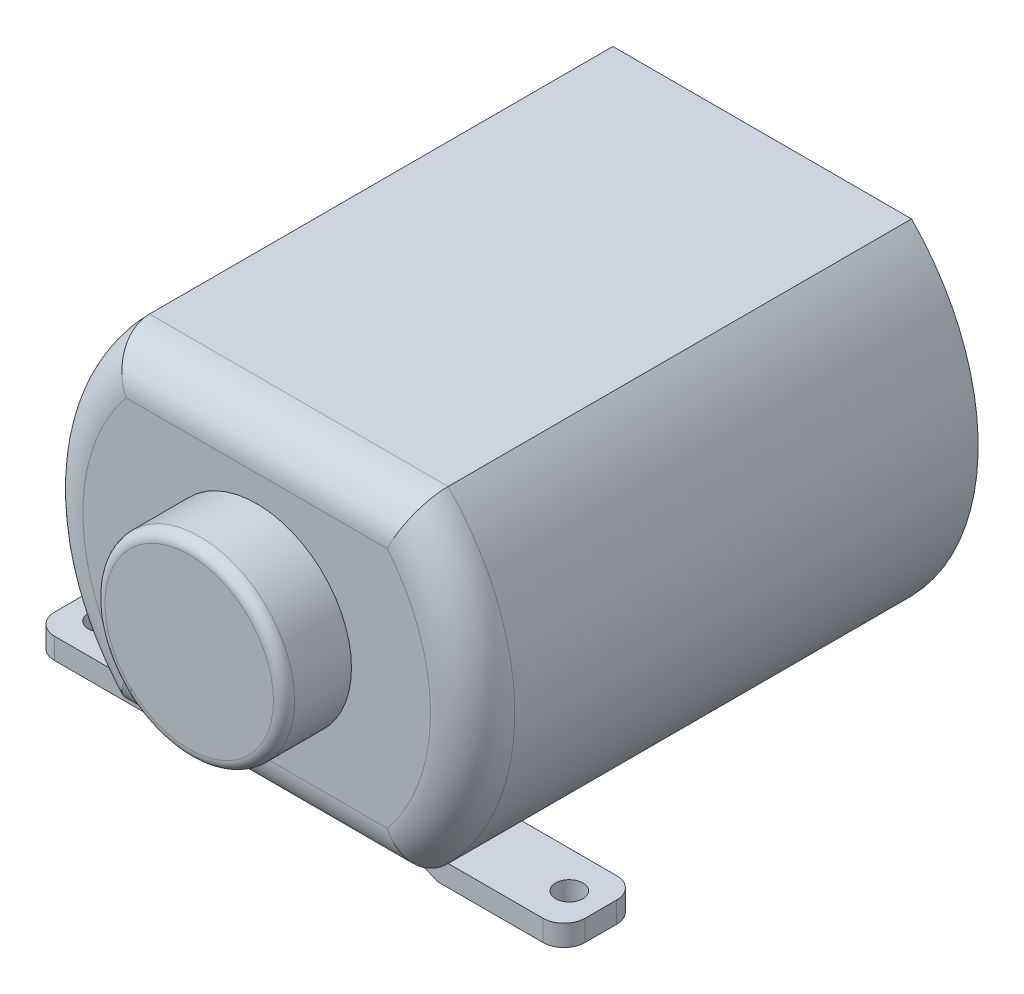
ISO-10303-21;
HEADER;
FILE_DESCRIPTION(('STEP AP214'),'2;1');
FILE_NAME('part.step','',(''),(''),'','','');
FILE_SCHEMA(('AUTOMOTIVE_DESIGN { 1 0 10303 214 1 1 1 1 }'));
ENDSEC;
DATA;
#1=APPLICATION_CONTEXT('core data for automotive mechanical design processes');
#2=APPLICATION_PROTOCOL_DEFINITION('international standard','automotive_design',2000,#1);
#3=PRODUCT_CONTEXT('',#1,'mechanical');
#4=PRODUCT('Part','Part','',(#3));
#5=PRODUCT_RELATED_PRODUCT_CATEGORY('part','',(#4));
#6=PRODUCT_DEFINITION_FORMATION('','',#4);
#7=PRODUCT_DEFINITION_CONTEXT('part definition',#1,'design');
#8=PRODUCT_DEFINITION('design','',#6,#7);
#9=PRODUCT_DEFINITION_SHAPE('','',#8);
#10=(LENGTH_UNIT() NAMED_UNIT(*) SI_UNIT(.MILLI.,.METRE.));
#11=(NAMED_UNIT(*) PLANE_ANGLE_UNIT() SI_UNIT($,.RADIAN.));
#12=(NAMED_UNIT(*) SI_UNIT($,.STERADIAN.) SOLID_ANGLE_UNIT());
#13=UNCERTAINTY_MEASURE_WITH_UNIT(LENGTH_MEASURE(1.E-05),#10,'distance_accuracy_value','');
#14=(GEOMETRIC_REPRESENTATION_CONTEXT(3) GLOBAL_UNCERTAINTY_ASSIGNED_CONTEXT((#13)) GLOBAL_UNIT_ASSIGNED_CONTEXT((#10,
#11,#12)) REPRESENTATION_CONTEXT('',''));
#15=CARTESIAN_POINT('',(0.,0.,0.));
#16=DIRECTION('',(0.,0.,1.));
#17=DIRECTION('',(1.,0.,0.));
#18=AXIS2_PLACEMENT_3D('',#15,#16,#17);
#19=CARTESIAN_POINT('',(7.09,-7.75,24.));
#20=DIRECTION('',(0.,1.,0.));
#21=DIRECTION('',(0.,0.,1.));
#22=AXIS2_PLACEMENT_3D('',#19,#20,#21);
#23=PLANE('',#22);
#24=DIRECTION('',(-1.,0.,0.));
#25=VECTOR('',#24,1.);
#26=CARTESIAN_POINT('',(6.59,-7.75,18.5));
#27=LINE('',#26,#25);
#28=CARTESIAN_POINT('',(7.09,-7.75,18.5));
#29=VERTEX_POINT('',#28);
#30=CARTESIAN_POINT('',(2.23110105645932,-7.75,18.5));
#31=VERTEX_POINT('',#30);
#32=EDGE_CURVE('E58',#29,#31,#27,.T.);
#33=ORIENTED_EDGE('',*,*,#32,.T.);
#34=DIRECTION('',(0.,0.,-1.));
#35=VECTOR('',#34,1.);
#36=CARTESIAN_POINT('',(2.23110105645932,-7.75,24.));
#37=LINE('',#36,#35);
#38=CARTESIAN_POINT('',(2.23110105645932,-7.75,22.));
#39=VERTEX_POINT('',#38);
#40=EDGE_CURVE('E192',#31,#39,#37,.F.);
#41=ORIENTED_EDGE('',*,*,#40,.T.);
#42=DIRECTION('',(1.,0.,0.));
#43=VECTOR('',#42,1.);
#44=CARTESIAN_POINT('',(-7.09,-7.75,22.));
#45=LINE('',#44,#43);
#46=CARTESIAN_POINT('',(-2.23110105645932,-7.75,22.));
#47=VERTEX_POINT('',#46);
#48=EDGE_CURVE('E477',#39,#47,#45,.F.);
#49=ORIENTED_EDGE('',*,*,#48,.T.);
#50=DIRECTION('',(0.,0.,-1.));
#51=VECTOR('',#50,1.);
#52=CARTESIAN_POINT('',(-2.23110105645932,-7.75,24.));
#53=LINE('',#52,#51);
#54=CARTESIAN_POINT('',(-2.23110105645932,-7.75,18.5));
#55=VERTEX_POINT('',#54);
#56=EDGE_CURVE('E201',#47,#55,#53,.T.);
#57=ORIENTED_EDGE('',*,*,#56,.T.);
#58=DIRECTION('',(1.,0.,0.));
#59=VECTOR('',#58,1.);
#60=CARTESIAN_POINT('',(-6.59,-7.75,18.5));
#61=LINE('',#60,#59);
#62=CARTESIAN_POINT('',(-7.09,-7.75,18.5));
#63=VERTEX_POINT('',#62);
#64=EDGE_CURVE('E423',#63,#55,#61,.T.);
#65=ORIENTED_EDGE('',*,*,#64,.F.);
#66=DIRECTION('',(0.,0.,-1.));
#67=VECTOR('',#66,1.);
#68=CARTESIAN_POINT('',(-7.09,-7.75,24.));
#69=LINE('',#68,#67);
#70=CARTESIAN_POINT('',(-7.09,-7.75,0.));
#71=VERTEX_POINT('',#70);
#72=EDGE_CURVE('E459',#63,#71,#69,.T.);
#73=ORIENTED_EDGE('',*,*,#72,.T.);
#74=DIRECTION('',(1.,0.,0.));
#75=VECTOR('',#74,1.);
#76=CARTESIAN_POINT('',(7.09,-7.75,0.));
#77=LINE('',#76,#75);
#78=CARTESIAN_POINT('',(7.09,-7.75,0.));
#79=VERTEX_POINT('',#78);
#80=EDGE_CURVE('E442',#71,#79,#77,.T.);
#81=ORIENTED_EDGE('',*,*,#80,.T.);
#82=DIRECTION('',(0.,0.,-1.));
#83=VECTOR('',#82,1.);
#84=CARTESIAN_POINT('',(7.09,-7.75,24.));
#85=LINE('',#84,#83);
#86=EDGE_CURVE('E455',#29,#79,#85,.T.);
#87=ORIENTED_EDGE('',*,*,#86,.F.);
#88=EDGE_LOOP('',(#33,#41,#49,#57,#65,#73,#81,#87));
#89=FACE_BOUND('',#88,.T.);
#90=ADVANCED_FACE('F43',(#89),#23,.F.);
#91=CARTESIAN_POINT('',(0.833560126582283,0.,24.));
#92=DIRECTION('',(0.,0.,-1.));
#93=DIRECTION('',(-1.,0.,0.));
#94=AXIS2_PLACEMENT_3D('',#91,#92,#93);
#95=CYLINDRICAL_SURFACE('',#94,11.0835601265823);
#96=CARTESIAN_POINT('',(-7.09,-7.75,22.));
#97=VERTEX_POINT('',#96);
#98=EDGE_CURVE('E460',#97,#63,#69,.T.);
#99=ORIENTED_EDGE('',*,*,#98,.F.);
#100=CARTESIAN_POINT('',(0.833560126582283,0.,22.));
#101=DIRECTION('',(0.,0.,1.));
#102=DIRECTION('',(1.,0.,0.));
#103=AXIS2_PLACEMENT_3D('',#100,#101,#102);
#104=CIRCLE('',#103,11.0835601265823);
#105=CARTESIAN_POINT('',(-7.09,7.75,22.));
#106=VERTEX_POINT('',#105);
#107=EDGE_CURVE('E210',#97,#106,#104,.F.);
#108=ORIENTED_EDGE('',*,*,#107,.T.);
#109=DIRECTION('',(0.,0.,-1.));
#110=VECTOR('',#109,1.);
#111=CARTESIAN_POINT('',(-7.09,7.75,24.));
#112=LINE('',#111,#110);
#113=CARTESIAN_POINT('',(-7.09,7.75,0.));
#114=VERTEX_POINT('',#113);
#115=EDGE_CURVE('E451',#106,#114,#112,.T.);
#116=ORIENTED_EDGE('',*,*,#115,.T.);
#117=CARTESIAN_POINT('',(0.833560126582283,0.,0.));
#118=DIRECTION('',(0.,0.,1.));
#119=DIRECTION('',(1.,0.,0.));
#120=AXIS2_PLACEMENT_3D('',#117,#118,#119);
#121=CIRCLE('',#120,11.0835601265823);
#122=EDGE_CURVE('E220',#114,#71,#121,.T.);
#123=ORIENTED_EDGE('',*,*,#122,.T.);
#124=ORIENTED_EDGE('',*,*,#72,.F.);
#125=EDGE_LOOP('',(#99,#108,#116,#123,#124));
#126=FACE_BOUND('',#125,.T.);
#127=ADVANCED_FACE('F257',(#126),#95,.T.);
#128=CARTESIAN_POINT('',(-0.833560126582283,0.,24.));
#129=DIRECTION('',(0.,0.,-1.));
#130=DIRECTION('',(-1.,0.,0.));
#131=AXIS2_PLACEMENT_3D('',#128,#129,#130);
#132=CYLINDRICAL_SURFACE('',#131,11.0835601265823);
#133=DIRECTION('',(0.,0.,-1.));
#134=VECTOR('',#133,1.);
#135=CARTESIAN_POINT('',(7.09,7.75,24.));
#136=LINE('',#135,#134);
#137=CARTESIAN_POINT('',(7.09,7.75,22.));
#138=VERTEX_POINT('',#137);
#139=CARTESIAN_POINT('',(7.09,7.75,0.));
#140=VERTEX_POINT('',#139);
#141=EDGE_CURVE('E453',#138,#140,#136,.T.);
#142=ORIENTED_EDGE('',*,*,#141,.F.);
#143=CARTESIAN_POINT('',(-0.833560126582283,0.,22.));
#144=DIRECTION('',(0.,0.,1.));
#145=DIRECTION('',(1.,0.,0.));
#146=AXIS2_PLACEMENT_3D('',#143,#144,#145);
#147=CIRCLE('',#146,11.0835601265823);
#148=CARTESIAN_POINT('',(7.09,-7.75,22.));
#149=VERTEX_POINT('',#148);
#150=EDGE_CURVE('E475',#138,#149,#147,.F.);
#151=ORIENTED_EDGE('',*,*,#150,.T.);
#152=EDGE_CURVE('E456',#149,#29,#85,.T.);
#153=ORIENTED_EDGE('',*,*,#152,.T.);
#154=ORIENTED_EDGE('',*,*,#86,.T.);
#155=CARTESIAN_POINT('',(-0.833560126582283,0.,0.));
#156=DIRECTION('',(0.,0.,1.));
#157=DIRECTION('',(-1.,0.,0.));
#158=AXIS2_PLACEMENT_3D('',#155,#156,#157);
#159=CIRCLE('',#158,11.0835601265823);
#160=EDGE_CURVE('E445',#79,#140,#159,.T.);
#161=ORIENTED_EDGE('',*,*,#160,.T.);
#162=EDGE_LOOP('',(#142,#151,#153,#154,#161));
#163=FACE_BOUND('',#162,.T.);
#164=ADVANCED_FACE('F261',(#163),#132,.T.);
#165=CARTESIAN_POINT('',(7.09,7.75,24.));
#166=DIRECTION('',(0.,-1.,0.));
#167=DIRECTION('',(0.,0.,-1.));
#168=AXIS2_PLACEMENT_3D('',#165,#166,#167);
#169=PLANE('',#168);
#170=ORIENTED_EDGE('',*,*,#115,.F.);
#171=DIRECTION('',(-1.,0.,0.));
#172=VECTOR('',#171,1.);
#173=CARTESIAN_POINT('',(7.09,7.75,22.));
#174=LINE('',#173,#172);
#175=EDGE_CURVE('E472',#106,#138,#174,.F.);
#176=ORIENTED_EDGE('',*,*,#175,.T.);
#177=ORIENTED_EDGE('',*,*,#141,.T.);
#178=DIRECTION('',(-1.,0.,0.));
#179=VECTOR('',#178,1.);
#180=CARTESIAN_POINT('',(7.09,7.75,0.));
#181=LINE('',#180,#179);
#182=EDGE_CURVE('E448',#140,#114,#181,.T.);
#183=ORIENTED_EDGE('',*,*,#182,.T.);
#184=EDGE_LOOP('',(#170,#176,#177,#183));
#185=FACE_BOUND('',#184,.T.);
#186=ADVANCED_FACE('F267',(#185),#169,.F.);
#187=CARTESIAN_POINT('',(0.833560126582283,0.,24.));
#188=DIRECTION('',(0.,0.,1.));
#189=DIRECTION('',(1.,0.,0.));
#190=AXIS2_PLACEMENT_3D('',#187,#188,#189);
#191=PLANE('',#190);
#192=CARTESIAN_POINT('',(0.,0.,24.));
#193=DIRECTION('',(0.,0.,1.));
#194=DIRECTION('',(1.,0.,0.));
#195=AXIS2_PLACEMENT_3D('',#192,#193,#194);
#196=CIRCLE('',#195,4.5);
#197=CARTESIAN_POINT('',(4.5,0.,24.));
#198=VERTEX_POINT('',#197);
#199=EDGE_CURVE('E437',#198,#198,#196,.T.);
#200=ORIENTED_EDGE('',*,*,#199,.F.);
#201=EDGE_LOOP('',(#200));
#202=FACE_BOUND('',#201,.T.);
#203=CARTESIAN_POINT('',(-0.833560126582283,0.,24.));
#204=DIRECTION('',(0.,0.,1.));
#205=DIRECTION('',(1.,0.,0.));
#206=AXIS2_PLACEMENT_3D('',#203,#204,#205);
#207=CIRCLE('',#206,9.08356012658228);
#208=CARTESIAN_POINT('',(6.19840720647861,-5.75,24.));
#209=VERTEX_POINT('',#208);
#210=CARTESIAN_POINT('',(6.19840720647861,5.75,24.));
#211=VERTEX_POINT('',#210);
#212=EDGE_CURVE('E467',#209,#211,#207,.T.);
#213=ORIENTED_EDGE('',*,*,#212,.T.);
#214=DIRECTION('',(-1.,0.,0.));
#215=VECTOR('',#214,1.);
#216=CARTESIAN_POINT('',(-7.09,5.75,24.));
#217=LINE('',#216,#215);
#218=CARTESIAN_POINT('',(-6.19840720647861,5.75,24.));
#219=VERTEX_POINT('',#218);
#220=EDGE_CURVE('E469',#211,#219,#217,.T.);
#221=ORIENTED_EDGE('',*,*,#220,.T.);
#222=CARTESIAN_POINT('',(0.833560126582283,0.,24.));
#223=DIRECTION('',(0.,0.,1.));
#224=DIRECTION('',(1.,0.,0.));
#225=AXIS2_PLACEMENT_3D('',#222,#223,#224);
#226=CIRCLE('',#225,9.08356012658228);
#227=CARTESIAN_POINT('',(-6.19840720647861,-5.75,24.));
#228=VERTEX_POINT('',#227);
#229=EDGE_CURVE('E463',#219,#228,#226,.T.);
#230=ORIENTED_EDGE('',*,*,#229,.T.);
#231=DIRECTION('',(1.,0.,0.));
#232=VECTOR('',#231,1.);
#233=CARTESIAN_POINT('',(7.09,-5.75,24.));
#234=LINE('',#233,#232);
#235=EDGE_CURVE('E465',#228,#209,#234,.T.);
#236=ORIENTED_EDGE('',*,*,#235,.T.);
#237=EDGE_LOOP('',(#213,#221,#230,#236));
#238=FACE_BOUND('',#237,.T.);
#239=ADVANCED_FACE('F271',(#202,#238),#191,.T.);
#240=CARTESIAN_POINT('',(0.833560126582283,0.,0.));
#241=DIRECTION('',(0.,0.,1.));
#242=DIRECTION('',(1.,0.,0.));
#243=AXIS2_PLACEMENT_3D('',#240,#241,#242);
#244=PLANE('',#243);
#245=ORIENTED_EDGE('',*,*,#122,.F.);
#246=ORIENTED_EDGE('',*,*,#182,.F.);
#247=ORIENTED_EDGE('',*,*,#160,.F.);
#248=ORIENTED_EDGE('',*,*,#80,.F.);
#249=EDGE_LOOP('',(#245,#246,#247,#248));
#250=FACE_BOUND('',#249,.T.);
#251=ADVANCED_FACE('F273',(#250),#244,.F.);
#252=CARTESIAN_POINT('',(0.833560126582283,-5.75,22.));
#253=DIRECTION('',(-1.,0.,0.));
#254=DIRECTION('',(0.,0.,1.));
#255=AXIS2_PLACEMENT_3D('',#252,#253,#254);
#256=CYLINDRICAL_SURFACE('',#255,2.);
#257=CARTESIAN_POINT('',(-7.09,-7.75,22.));
#258=CARTESIAN_POINT('',(-7.09000251059634,-7.75000744147521,22.0529926489327));
#259=CARTESIAN_POINT('',(-7.08911394930164,-7.74789397815356,22.1059815092053));
#260=CARTESIAN_POINT('',(-7.08557416584439,-7.73948228512946,22.211556737457));
#261=CARTESIAN_POINT('',(-7.0829232863609,-7.73318486898794,22.2641431816747));
#262=CARTESIAN_POINT('',(-7.07588778205616,-7.71648469591555,22.3683995791925));
#263=CARTESIAN_POINT('',(-7.071507825864,-7.70609299399214,22.4200716121355));
#264=CARTESIAN_POINT('',(-7.06105559519545,-7.68132345748143,22.5222623695));
#265=CARTESIAN_POINT('',(-7.05498329405841,-7.6669455600969,22.5727810757388));
#266=CARTESIAN_POINT('',(-7.03429836769747,-7.61803887064901,22.7220551754875));
#267=CARTESIAN_POINT('',(-7.01720956248533,-7.57771760645773,22.8186482446152));
#268=CARTESIAN_POINT('',(-6.97698013341922,-7.48321793665207,23.0033665951101));
#269=CARTESIAN_POINT('',(-6.95383739606473,-7.42903469179918,23.0914889045122));
#270=CARTESIAN_POINT('',(-6.90137934603258,-7.30689666682277,23.2598420439186));
#271=CARTESIAN_POINT('',(-6.87189996524071,-7.23857812282158,23.3397575921521));
#272=CARTESIAN_POINT('',(-6.80801045594482,-7.09151124061425,23.4870063175584));
#273=CARTESIAN_POINT('',(-6.77359891436954,-7.01275991389181,23.5543358760448));
#274=CARTESIAN_POINT('',(-6.69796902293111,-6.84100105638926,23.6798358121778));
#275=CARTESIAN_POINT('',(-6.65643558571622,-6.74737008049875,23.7369617046311));
#276=CARTESIAN_POINT('',(-6.56962348946352,-6.55344731168661,23.8347405122226));
#277=CARTESIAN_POINT('',(-6.52434288879081,-6.45315207097246,23.8753848220727));
#278=CARTESIAN_POINT('',(-6.43372165266033,-6.25439815965746,23.9379940682496));
#279=CARTESIAN_POINT('',(-6.38853138569523,-6.15616035109053,23.9608912176401));
#280=CARTESIAN_POINT('',(-6.29659240195031,-5.95824664778769,23.9916401391918));
#281=CARTESIAN_POINT('',(-6.2498469832177,-5.85857402258226,23.999521913842));
#282=CARTESIAN_POINT('',(-6.20130984149857,-5.75612389497142,23.9999929839316));
#283=CARTESIAN_POINT('',(-6.19985867876987,-5.75306179617439,24.0000000157442));
#284=CARTESIAN_POINT('',(-6.19840720647861,-5.75,24.));
#285=B_SPLINE_CURVE_WITH_KNOTS('',3,(#257,#258,#259,#260,#261,#262,#263,#264,#265,#266,#267,
#268,#269,#270,#271,#272,#273,#274,#275,#276,#277,#278,#279,#280,#281,#282,#283,#284),
.UNSPECIFIED.,.F.,.F.,(4,2,2,2,2,2,2,2,2,2,2,2,2,4),(0.,0.158921879220741,0.317812865453171,
0.476277737332346,0.634745105757474,0.951319828516782,1.26800521915922,1.59417259659958,
1.92043360896063,2.27080395920088,2.62135700838885,2.95193995991055,3.28186167206402,
3.29202733152508),.UNSPECIFIED.);
#286=EDGE_CURVE('E221',#97,#228,#285,.T.);
#287=ORIENTED_EDGE('',*,*,#286,.F.);
#288=DIRECTION('',(-1.,0.,0.));
#289=VECTOR('',#288,1.);
#290=CARTESIAN_POINT('',(-6.59,-7.75,22.));
#291=LINE('',#290,#289);
#292=EDGE_CURVE('E414',#47,#97,#291,.T.);
#293=ORIENTED_EDGE('',*,*,#292,.F.);
#294=ORIENTED_EDGE('',*,*,#48,.F.);
#295=EDGE_CURVE('E478',#149,#39,#45,.F.);
#296=ORIENTED_EDGE('',*,*,#295,.F.);
#297=CARTESIAN_POINT('',(7.09,-7.75,22.));
#298=CARTESIAN_POINT('',(7.09000251059634,-7.75000744147521,22.0529926489327));
#299=CARTESIAN_POINT('',(7.08911394930164,-7.74789397815356,22.1059815092053));
#300=CARTESIAN_POINT('',(7.08557416584439,-7.73948228512946,22.211556737457));
#301=CARTESIAN_POINT('',(7.0829232863609,-7.73318486898794,22.2641431816747));
#302=CARTESIAN_POINT('',(7.07588778205616,-7.71648469591555,22.3683995791925));
#303=CARTESIAN_POINT('',(7.07150782586399,-7.70609299399214,22.4200716121355));
#304=CARTESIAN_POINT('',(7.06105559519545,-7.68132345748143,22.5222623695));
#305=CARTESIAN_POINT('',(7.05498329405841,-7.6669455600969,22.5727810757388));
#306=CARTESIAN_POINT('',(7.03429836769747,-7.61803887064901,22.7220551754875));
#307=CARTESIAN_POINT('',(7.01720956248533,-7.57771760645773,22.8186482446152));
#308=CARTESIAN_POINT('',(6.97698013341922,-7.48321793665207,23.0033665951101));
#309=CARTESIAN_POINT('',(6.95383739606473,-7.42903469179918,23.0914889045122));
#310=CARTESIAN_POINT('',(6.90137934603258,-7.30689666682277,23.2598420439186));
#311=CARTESIAN_POINT('',(6.8718999652407,-7.23857812282158,23.3397575921521));
#312=CARTESIAN_POINT('',(6.80801045594482,-7.09151124061425,23.4870063175584));
#313=CARTESIAN_POINT('',(6.77359891436954,-7.0127599138918,23.5543358760448));
#314=CARTESIAN_POINT('',(6.69796902293111,-6.84100105638927,23.6798358121778));
#315=CARTESIAN_POINT('',(6.6564355857162,-6.74737008049877,23.7369617046311));
#316=CARTESIAN_POINT('',(6.56962348946355,-6.5534473116866,23.8347405122226));
#317=CARTESIAN_POINT('',(6.52434288879091,-6.45315207097241,23.8753848220727));
#318=CARTESIAN_POINT('',(6.43372165266024,-6.2543981596575,23.9379940682496));
#319=CARTESIAN_POINT('',(6.3885313856949,-6.15616035109068,23.9608912176401));
#320=CARTESIAN_POINT('',(6.29659240195063,-5.95824664778753,23.9916401391919));
#321=CARTESIAN_POINT('',(6.24984698321891,-5.85857402258168,23.999521913842));
#322=CARTESIAN_POINT('',(6.20130984149864,-5.75612389497139,23.9999929839316));
#323=CARTESIAN_POINT('',(6.19985867876991,-5.75306179617437,24.0000000157442));
#324=CARTESIAN_POINT('',(6.19840720647861,-5.75,24.));
#325=B_SPLINE_CURVE_WITH_KNOTS('',3,(#297,#298,#299,#300,#301,#302,#303,#304,#305,#306,#307,
#308,#309,#310,#311,#312,#313,#314,#315,#316,#317,#318,#319,#320,#321,#322,#323,#324),
.UNSPECIFIED.,.F.,.F.,(4,2,2,2,2,2,2,2,2,2,2,2,2,4),(0.,0.158921879220741,0.317812865453171,
0.476277737332346,0.634745105757474,0.951319828516782,1.26800521915922,1.59417259659959,
1.92043360896063,2.27080395920088,2.62135700838885,2.95193995991056,3.28186167206402,
3.29202733152508),.UNSPECIFIED.);
#326=EDGE_CURVE('E211',#209,#149,#325,.F.);
#327=ORIENTED_EDGE('',*,*,#326,.F.);
#328=ORIENTED_EDGE('',*,*,#235,.F.);
#329=EDGE_LOOP('',(#287,#293,#294,#296,#327,#328));
#330=FACE_BOUND('',#329,.T.);
#331=ADVANCED_FACE('F228',(#330),#256,.T.);
#332=CARTESIAN_POINT('',(-0.833560126582283,0.,22.));
#333=DIRECTION('',(0.,0.,1.));
#334=DIRECTION('',(1.,0.,0.));
#335=AXIS2_PLACEMENT_3D('',#332,#333,#334);
#336=TOROIDAL_SURFACE('',#335,9.08356012658228,2.);
#337=ORIENTED_EDGE('',*,*,#326,.T.);
#338=ORIENTED_EDGE('',*,*,#150,.F.);
#339=CARTESIAN_POINT('',(7.09,7.75,22.));
#340=CARTESIAN_POINT('',(7.09000251059635,7.7500074414752,22.0529926489327));
#341=CARTESIAN_POINT('',(7.08911394930164,7.74789397815355,22.1059815092053));
#342=CARTESIAN_POINT('',(7.0855741658444,7.73948228512946,22.211556737457));
#343=CARTESIAN_POINT('',(7.0829232863609,7.73318486898793,22.2641431816747));
#344=CARTESIAN_POINT('',(7.07588778205616,7.71648469591554,22.3683995791925));
#345=CARTESIAN_POINT('',(7.071507825864,7.70609299399213,22.4200716121355));
#346=CARTESIAN_POINT('',(7.06105559519546,7.68132345748143,22.5222623695));
#347=CARTESIAN_POINT('',(7.05498329405842,7.6669455600969,22.5727810757388));
#348=CARTESIAN_POINT('',(7.03429836769748,7.61803887064901,22.7220551754875));
#349=CARTESIAN_POINT('',(7.01720956248533,7.57771760645773,22.8186482446152));
#350=CARTESIAN_POINT('',(6.97698013341922,7.48321793665207,23.0033665951101));
#351=CARTESIAN_POINT('',(6.95383739606474,7.42903469179917,23.0914889045122));
#352=CARTESIAN_POINT('',(6.90137934603259,7.30689666682277,23.2598420439186));
#353=CARTESIAN_POINT('',(6.87189996524071,7.23857812282158,23.3397575921521));
#354=CARTESIAN_POINT('',(6.80801045594483,7.09151124061425,23.4870063175584));
#355=CARTESIAN_POINT('',(6.77359891436955,7.0127599138918,23.5543358760448));
#356=CARTESIAN_POINT('',(6.69796902293111,6.84100105638926,23.6798358121778));
#357=CARTESIAN_POINT('',(6.6564355857162,6.74737008049877,23.7369617046311));
#358=CARTESIAN_POINT('',(6.56962348946355,6.5534473116866,23.8347405122226));
#359=CARTESIAN_POINT('',(6.52434288879091,6.45315207097241,23.8753848220727));
#360=CARTESIAN_POINT('',(6.43372165266025,6.25439815965749,23.9379940682496));
#361=CARTESIAN_POINT('',(6.3885313856949,6.15616035109068,23.9608912176401));
#362=CARTESIAN_POINT('',(6.29659240195064,5.95824664778752,23.9916401391919));
#363=CARTESIAN_POINT('',(6.24984698321893,5.85857402258167,23.999521913842));
#364=CARTESIAN_POINT('',(6.20130984149864,5.75612389497138,23.9999929839316));
#365=CARTESIAN_POINT('',(6.19985867876991,5.75306179617437,24.0000000157442));
#366=CARTESIAN_POINT('',(6.19840720647861,5.75,24.));
#367=B_SPLINE_CURVE_WITH_KNOTS('',3,(#339,#340,#341,#342,#343,#344,#345,#346,#347,#348,#349,
#350,#351,#352,#353,#354,#355,#356,#357,#358,#359,#360,#361,#362,#363,#364,#365,#366),
.UNSPECIFIED.,.F.,.F.,(4,2,2,2,2,2,2,2,2,2,2,2,2,4),(0.,0.158921879220741,0.317812865453171,
0.476277737332346,0.634745105757475,0.951319828516782,1.26800521915922,1.59417259659958,
1.92043360896063,2.27080395920087,2.62135700838885,2.95193995991056,3.28186167206402,
3.29202733152508),.UNSPECIFIED.);
#368=EDGE_CURVE('E239',#211,#138,#367,.F.);
#369=ORIENTED_EDGE('',*,*,#368,.F.);
#370=ORIENTED_EDGE('',*,*,#212,.F.);
#371=EDGE_LOOP('',(#337,#338,#369,#370));
#372=FACE_BOUND('',#371,.T.);
#373=ADVANCED_FACE('F231',(#372),#336,.T.);
#374=CARTESIAN_POINT('',(0.833560126582283,0.,22.));
#375=DIRECTION('',(0.,0.,1.));
#376=DIRECTION('',(1.,0.,0.));
#377=AXIS2_PLACEMENT_3D('',#374,#375,#376);
#378=TOROIDAL_SURFACE('',#377,9.08356012658228,2.);
#379=ORIENTED_EDGE('',*,*,#286,.T.);
#380=ORIENTED_EDGE('',*,*,#229,.F.);
#381=CARTESIAN_POINT('',(-7.09,7.75,22.));
#382=CARTESIAN_POINT('',(-7.09000251059635,7.7500074414752,22.0529926489327));
#383=CARTESIAN_POINT('',(-7.08911394930164,7.74789397815355,22.1059815092053));
#384=CARTESIAN_POINT('',(-7.0855741658444,7.73948228512946,22.211556737457));
#385=CARTESIAN_POINT('',(-7.0829232863609,7.73318486898793,22.2641431816747));
#386=CARTESIAN_POINT('',(-7.07588778205616,7.71648469591554,22.3683995791925));
#387=CARTESIAN_POINT('',(-7.071507825864,7.70609299399213,22.4200716121355));
#388=CARTESIAN_POINT('',(-7.06105559519546,7.68132345748143,22.5222623695));
#389=CARTESIAN_POINT('',(-7.05498329405842,7.6669455600969,22.5727810757388));
#390=CARTESIAN_POINT('',(-7.03429836769748,7.61803887064901,22.7220551754875));
#391=CARTESIAN_POINT('',(-7.01720956248533,7.57771760645773,22.8186482446152));
#392=CARTESIAN_POINT('',(-6.97698013341922,7.48321793665207,23.0033665951101));
#393=CARTESIAN_POINT('',(-6.95383739606474,7.42903469179917,23.0914889045122));
#394=CARTESIAN_POINT('',(-6.90137934603259,7.30689666682277,23.2598420439186));
#395=CARTESIAN_POINT('',(-6.87189996524071,7.23857812282158,23.3397575921521));
#396=CARTESIAN_POINT('',(-6.80801045594483,7.09151124061425,23.4870063175584));
#397=CARTESIAN_POINT('',(-6.77359891436955,7.0127599138918,23.5543358760448));
#398=CARTESIAN_POINT('',(-6.69796902293111,6.84100105638926,23.6798358121778));
#399=CARTESIAN_POINT('',(-6.6564355857162,6.74737008049877,23.7369617046311));
#400=CARTESIAN_POINT('',(-6.56962348946355,6.5534473116866,23.8347405122226));
#401=CARTESIAN_POINT('',(-6.52434288879091,6.45315207097241,23.8753848220727));
#402=CARTESIAN_POINT('',(-6.43372165266025,6.25439815965749,23.9379940682496));
#403=CARTESIAN_POINT('',(-6.3885313856949,6.15616035109068,23.9608912176401));
#404=CARTESIAN_POINT('',(-6.29659240195064,5.95824664778752,23.9916401391919));
#405=CARTESIAN_POINT('',(-6.24984698321893,5.85857402258167,23.999521913842));
#406=CARTESIAN_POINT('',(-6.20130984149864,5.75612389497138,23.9999929839316));
#407=CARTESIAN_POINT('',(-6.19985867876991,5.75306179617437,24.0000000157442));
#408=CARTESIAN_POINT('',(-6.19840720647861,5.75,24.));
#409=B_SPLINE_CURVE_WITH_KNOTS('',3,(#381,#382,#383,#384,#385,#386,#387,#388,#389,#390,#391,
#392,#393,#394,#395,#396,#397,#398,#399,#400,#401,#402,#403,#404,#405,#406,#407,#408),
.UNSPECIFIED.,.F.,.F.,(4,2,2,2,2,2,2,2,2,2,2,2,2,4),(0.,0.158921879220741,0.317812865453171,
0.476277737332346,0.634745105757475,0.951319828516782,1.26800521915922,1.59417259659958,
1.92043360896063,2.27080395920087,2.62135700838885,2.95193995991056,3.28186167206402,
3.29202733152508),.UNSPECIFIED.);
#410=EDGE_CURVE('E245',#106,#219,#409,.T.);
#411=ORIENTED_EDGE('',*,*,#410,.F.);
#412=ORIENTED_EDGE('',*,*,#107,.F.);
#413=EDGE_LOOP('',(#379,#380,#411,#412));
#414=FACE_BOUND('',#413,.T.);
#415=ADVANCED_FACE('F234',(#414),#378,.T.);
#416=CARTESIAN_POINT('',(0.833560126582283,5.75,22.));
#417=DIRECTION('',(1.,0.,0.));
#418=DIRECTION('',(0.,0.,-1.));
#419=AXIS2_PLACEMENT_3D('',#416,#417,#418);
#420=CYLINDRICAL_SURFACE('',#419,2.);
#421=ORIENTED_EDGE('',*,*,#368,.T.);
#422=ORIENTED_EDGE('',*,*,#175,.F.);
#423=ORIENTED_EDGE('',*,*,#410,.T.);
#424=ORIENTED_EDGE('',*,*,#220,.F.);
#425=EDGE_LOOP('',(#421,#422,#423,#424));
#426=FACE_BOUND('',#425,.T.);
#427=ADVANCED_FACE('F251',(#426),#420,.T.);
#428=CARTESIAN_POINT('',(0.,0.,27.2));
#429=DIRECTION('',(0.,0.,-1.));
#430=DIRECTION('',(-1.,0.,0.));
#431=AXIS2_PLACEMENT_3D('',#428,#429,#430);
#432=CYLINDRICAL_SURFACE('',#431,4.5);
#433=CARTESIAN_POINT('',(0.,0.,26.7));
#434=DIRECTION('',(0.,0.,1.));
#435=DIRECTION('',(1.,0.,0.));
#436=AXIS2_PLACEMENT_3D('',#433,#434,#435);
#437=CIRCLE('',#436,4.5);
#438=CARTESIAN_POINT('',(4.5,0.,26.7));
#439=VERTEX_POINT('',#438);
#440=EDGE_CURVE('E204',#439,#439,#437,.F.);
#441=ORIENTED_EDGE('',*,*,#440,.T.);
#442=EDGE_LOOP('',(#441));
#443=FACE_BOUND('',#442,.T.);
#444=ORIENTED_EDGE('',*,*,#199,.T.);
#445=EDGE_LOOP('',(#444));
#446=FACE_BOUND('',#445,.T.);
#447=ADVANCED_FACE('F255',(#443,#446),#432,.T.);
#448=CARTESIAN_POINT('',(0.,0.,27.2));
#449=DIRECTION('',(0.,0.,1.));
#450=DIRECTION('',(1.,0.,0.));
#451=AXIS2_PLACEMENT_3D('',#448,#449,#450);
#452=PLANE('',#451);
#453=CARTESIAN_POINT('',(0.,0.,27.2));
#454=DIRECTION('',(0.,0.,1.));
#455=DIRECTION('',(1.,0.,0.));
#456=AXIS2_PLACEMENT_3D('',#453,#454,#455);
#457=CIRCLE('',#456,4.);
#458=CARTESIAN_POINT('',(4.,0.,27.2));
#459=VERTEX_POINT('',#458);
#460=EDGE_CURVE('E207',#459,#459,#457,.T.);
#461=ORIENTED_EDGE('',*,*,#460,.T.);
#462=EDGE_LOOP('',(#461));
#463=FACE_BOUND('',#462,.T.);
#464=ADVANCED_FACE('F282',(#463),#452,.T.);
#465=CARTESIAN_POINT('',(0.,0.,26.7));
#466=DIRECTION('',(0.,0.,1.));
#467=DIRECTION('',(1.,0.,0.));
#468=AXIS2_PLACEMENT_3D('',#465,#466,#467);
#469=TOROIDAL_SURFACE('',#468,4.,0.5);
#470=ORIENTED_EDGE('',*,*,#440,.F.);
#471=EDGE_LOOP('',(#470));
#472=FACE_BOUND('',#471,.T.);
#473=ORIENTED_EDGE('',*,*,#460,.F.);
#474=EDGE_LOOP('',(#473));
#475=FACE_BOUND('',#474,.T.);
#476=ADVANCED_FACE('F286',(#472,#475),#469,.T.);
#477=CARTESIAN_POINT('',(-11.59,-7.75,19.5));
#478=DIRECTION('',(0.,1.,0.));
#479=DIRECTION('',(0.,0.,1.));
#480=AXIS2_PLACEMENT_3D('',#477,#478,#479);
#481=PLANE('',#480);
#482=CARTESIAN_POINT('',(-11.09,-7.75,20.25));
#483=DIRECTION('',(0.,-1.,0.));
#484=DIRECTION('',(0.,0.,-1.));
#485=AXIS2_PLACEMENT_3D('',#482,#483,#484);
#486=CIRCLE('',#485,0.649999999999999);
#487=CARTESIAN_POINT('',(-11.09,-7.75,19.6));
#488=VERTEX_POINT('',#487);
#489=EDGE_CURVE('E391',#488,#488,#486,.T.);
#490=ORIENTED_EDGE('',*,*,#489,.T.);
#491=EDGE_LOOP('',(#490));
#492=FACE_BOUND('',#491,.T.);
#493=ORIENTED_EDGE('',*,*,#98,.T.);
#494=CARTESIAN_POINT('',(-11.59,-7.75,18.5));
#495=VERTEX_POINT('',#494);
#496=EDGE_CURVE('E402',#495,#63,#61,.T.);
#497=ORIENTED_EDGE('',*,*,#496,.F.);
#498=CARTESIAN_POINT('',(-11.59,-7.75,19.5));
#499=DIRECTION('',(0.,-1.,0.));
#500=DIRECTION('',(0.,0.,1.));
#501=AXIS2_PLACEMENT_3D('',#498,#499,#500);
#502=CIRCLE('',#501,1.);
#503=CARTESIAN_POINT('',(-12.59,-7.75,19.5));
#504=VERTEX_POINT('',#503);
#505=EDGE_CURVE('E421',#504,#495,#502,.T.);
#506=ORIENTED_EDGE('',*,*,#505,.F.);
#507=DIRECTION('',(0.,0.,-1.));
#508=VECTOR('',#507,1.);
#509=CARTESIAN_POINT('',(-12.59,-7.75,21.));
#510=LINE('',#509,#508);
#511=CARTESIAN_POINT('',(-12.59,-7.75,21.));
#512=VERTEX_POINT('',#511);
#513=EDGE_CURVE('E419',#512,#504,#510,.T.);
#514=ORIENTED_EDGE('',*,*,#513,.F.);
#515=CARTESIAN_POINT('',(-11.59,-7.75,21.));
#516=DIRECTION('',(0.,-1.,0.));
#517=DIRECTION('',(0.,0.,1.));
#518=AXIS2_PLACEMENT_3D('',#515,#516,#517);
#519=CIRCLE('',#518,1.);
#520=CARTESIAN_POINT('',(-11.59,-7.75,22.));
#521=VERTEX_POINT('',#520);
#522=EDGE_CURVE('E417',#521,#512,#519,.T.);
#523=ORIENTED_EDGE('',*,*,#522,.F.);
#524=EDGE_CURVE('E395',#97,#521,#291,.T.);
#525=ORIENTED_EDGE('',*,*,#524,.F.);
#526=EDGE_LOOP('',(#493,#497,#506,#514,#523,#525));
#527=FACE_BOUND('',#526,.T.);
#528=ADVANCED_FACE('F310',(#492,#527),#481,.T.);
#529=CARTESIAN_POINT('',(-11.59,-8.75,19.5));
#530=DIRECTION('',(0.,1.,0.));
#531=DIRECTION('',(0.,0.,1.));
#532=AXIS2_PLACEMENT_3D('',#529,#530,#531);
#533=PLANE('',#532);
#534=DIRECTION('',(0.,0.,1.));
#535=VECTOR('',#534,1.);
#536=CARTESIAN_POINT('',(-6.59,-8.75,22.));
#537=LINE('',#536,#535);
#538=CARTESIAN_POINT('',(-6.59,-8.75,18.5));
#539=VERTEX_POINT('',#538);
#540=CARTESIAN_POINT('',(-6.59,-8.75,22.));
#541=VERTEX_POINT('',#540);
#542=EDGE_CURVE('E398',#539,#541,#537,.T.);
#543=ORIENTED_EDGE('',*,*,#542,.T.);
#544=DIRECTION('',(-1.,0.,0.));
#545=VECTOR('',#544,1.);
#546=CARTESIAN_POINT('',(-6.59,-8.75,22.));
#547=LINE('',#546,#545);
#548=CARTESIAN_POINT('',(-11.59,-8.75,22.));
#549=VERTEX_POINT('',#548);
#550=EDGE_CURVE('E401',#541,#549,#547,.T.);
#551=ORIENTED_EDGE('',*,*,#550,.T.);
#552=CARTESIAN_POINT('',(-11.59,-8.75,21.));
#553=DIRECTION('',(0.,-1.,0.));
#554=DIRECTION('',(0.,0.,1.));
#555=AXIS2_PLACEMENT_3D('',#552,#553,#554);
#556=CIRCLE('',#555,1.);
#557=CARTESIAN_POINT('',(-12.59,-8.75,21.));
#558=VERTEX_POINT('',#557);
#559=EDGE_CURVE('E404',#549,#558,#556,.T.);
#560=ORIENTED_EDGE('',*,*,#559,.T.);
#561=DIRECTION('',(0.,0.,-1.));
#562=VECTOR('',#561,1.);
#563=CARTESIAN_POINT('',(-12.59,-8.75,21.));
#564=LINE('',#563,#562);
#565=CARTESIAN_POINT('',(-12.59,-8.75,19.5));
#566=VERTEX_POINT('',#565);
#567=EDGE_CURVE('E406',#558,#566,#564,.T.);
#568=ORIENTED_EDGE('',*,*,#567,.T.);
#569=CARTESIAN_POINT('',(-11.59,-8.75,19.5));
#570=DIRECTION('',(0.,-1.,0.));
#571=DIRECTION('',(0.,0.,1.));
#572=AXIS2_PLACEMENT_3D('',#569,#570,#571);
#573=CIRCLE('',#572,1.);
#574=CARTESIAN_POINT('',(-11.59,-8.75,18.5));
#575=VERTEX_POINT('',#574);
#576=EDGE_CURVE('E408',#566,#575,#573,.T.);
#577=ORIENTED_EDGE('',*,*,#576,.T.);
#578=DIRECTION('',(1.,0.,0.));
#579=VECTOR('',#578,1.);
#580=CARTESIAN_POINT('',(-6.59,-8.75,18.5));
#581=LINE('',#580,#579);
#582=EDGE_CURVE('E410',#575,#539,#581,.T.);
#583=ORIENTED_EDGE('',*,*,#582,.T.);
#584=EDGE_LOOP('',(#543,#551,#560,#568,#577,#583));
#585=FACE_BOUND('',#584,.T.);
#586=CARTESIAN_POINT('',(-11.09,-8.75,20.25));
#587=DIRECTION('',(0.,-1.,0.));
#588=DIRECTION('',(0.,0.,-1.));
#589=AXIS2_PLACEMENT_3D('',#586,#587,#588);
#590=CIRCLE('',#589,0.649999999999999);
#591=CARTESIAN_POINT('',(-11.09,-8.75,19.6));
#592=VERTEX_POINT('',#591);
#593=EDGE_CURVE('E392',#592,#592,#590,.T.);
#594=ORIENTED_EDGE('',*,*,#593,.F.);
#595=EDGE_LOOP('',(#594));
#596=FACE_BOUND('',#595,.T.);
#597=ADVANCED_FACE('F292',(#585,#596),#533,.F.);
#598=CARTESIAN_POINT('',(-6.59,-8.75,22.));
#599=DIRECTION('',(0.,0.,-1.));
#600=DIRECTION('',(-1.,0.,0.));
#601=AXIS2_PLACEMENT_3D('',#598,#599,#600);
#602=PLANE('',#601);
#603=ORIENTED_EDGE('',*,*,#292,.T.);
#604=ORIENTED_EDGE('',*,*,#524,.T.);
#605=DIRECTION('',(0.,1.,0.));
#606=VECTOR('',#605,1.);
#607=CARTESIAN_POINT('',(-11.59,-8.75,22.));
#608=LINE('',#607,#606);
#609=EDGE_CURVE('E434',#549,#521,#608,.T.);
#610=ORIENTED_EDGE('',*,*,#609,.F.);
#611=ORIENTED_EDGE('',*,*,#550,.F.);
#612=CARTESIAN_POINT('',(-2.23110105645932,-17.75,22.));
#613=DIRECTION('',(0.,0.,-1.));
#614=DIRECTION('',(-1.,0.,0.));
#615=AXIS2_PLACEMENT_3D('',#612,#613,#614);
#616=CIRCLE('',#615,10.);
#617=EDGE_CURVE('E196',#541,#47,#616,.T.);
#618=ORIENTED_EDGE('',*,*,#617,.T.);
#619=EDGE_LOOP('',(#603,#604,#610,#611,#618));
#620=FACE_BOUND('',#619,.T.);
#621=ADVANCED_FACE('F288',(#620),#602,.F.);
#622=CARTESIAN_POINT('',(-11.59,-8.75,21.));
#623=DIRECTION('',(0.,1.,0.));
#624=DIRECTION('',(0.,0.,1.));
#625=AXIS2_PLACEMENT_3D('',#622,#623,#624);
#626=CYLINDRICAL_SURFACE('',#625,1.);
#627=ORIENTED_EDGE('',*,*,#522,.T.);
#628=DIRECTION('',(0.,1.,0.));
#629=VECTOR('',#628,1.);
#630=CARTESIAN_POINT('',(-12.59,-8.75,21.));
#631=LINE('',#630,#629);
#632=EDGE_CURVE('E431',#558,#512,#631,.T.);
#633=ORIENTED_EDGE('',*,*,#632,.F.);
#634=ORIENTED_EDGE('',*,*,#559,.F.);
#635=ORIENTED_EDGE('',*,*,#609,.T.);
#636=EDGE_LOOP('',(#627,#633,#634,#635));
#637=FACE_BOUND('',#636,.T.);
#638=ADVANCED_FACE('F291',(#637),#626,.T.);
#639=CARTESIAN_POINT('',(-12.59,-8.75,21.));
#640=DIRECTION('',(1.,0.,0.));
#641=DIRECTION('',(0.,0.,-1.));
#642=AXIS2_PLACEMENT_3D('',#639,#640,#641);
#643=PLANE('',#642);
#644=ORIENTED_EDGE('',*,*,#513,.T.);
#645=DIRECTION('',(0.,1.,0.));
#646=VECTOR('',#645,1.);
#647=CARTESIAN_POINT('',(-12.59,-8.75,19.5));
#648=LINE('',#647,#646);
#649=EDGE_CURVE('E428',#566,#504,#648,.T.);
#650=ORIENTED_EDGE('',*,*,#649,.F.);
#651=ORIENTED_EDGE('',*,*,#567,.F.);
#652=ORIENTED_EDGE('',*,*,#632,.T.);
#653=EDGE_LOOP('',(#644,#650,#651,#652));
#654=FACE_BOUND('',#653,.T.);
#655=ADVANCED_FACE('F296',(#654),#643,.F.);
#656=CARTESIAN_POINT('',(-11.59,-8.75,19.5));
#657=DIRECTION('',(0.,1.,0.));
#658=DIRECTION('',(0.,0.,1.));
#659=AXIS2_PLACEMENT_3D('',#656,#657,#658);
#660=CYLINDRICAL_SURFACE('',#659,1.);
#661=ORIENTED_EDGE('',*,*,#505,.T.);
#662=DIRECTION('',(0.,1.,0.));
#663=VECTOR('',#662,1.);
#664=CARTESIAN_POINT('',(-11.59,-8.75,18.5));
#665=LINE('',#664,#663);
#666=EDGE_CURVE('E413',#575,#495,#665,.T.);
#667=ORIENTED_EDGE('',*,*,#666,.F.);
#668=ORIENTED_EDGE('',*,*,#576,.F.);
#669=ORIENTED_EDGE('',*,*,#649,.T.);
#670=EDGE_LOOP('',(#661,#667,#668,#669));
#671=FACE_BOUND('',#670,.T.);
#672=ADVANCED_FACE('F300',(#671),#660,.T.);
#673=CARTESIAN_POINT('',(-6.59,-8.75,18.5));
#674=DIRECTION('',(0.,0.,1.));
#675=DIRECTION('',(1.,0.,0.));
#676=AXIS2_PLACEMENT_3D('',#673,#674,#675);
#677=PLANE('',#676);
#678=ORIENTED_EDGE('',*,*,#496,.T.);
#679=ORIENTED_EDGE('',*,*,#64,.T.);
#680=CARTESIAN_POINT('',(-2.23110105645932,-17.75,18.5));
#681=DIRECTION('',(0.,0.,1.));
#682=DIRECTION('',(1.,0.,0.));
#683=AXIS2_PLACEMENT_3D('',#680,#681,#682);
#684=CIRCLE('',#683,10.);
#685=EDGE_CURVE('E194',#55,#539,#684,.T.);
#686=ORIENTED_EDGE('',*,*,#685,.T.);
#687=ORIENTED_EDGE('',*,*,#582,.F.);
#688=ORIENTED_EDGE('',*,*,#666,.T.);
#689=EDGE_LOOP('',(#678,#679,#686,#687,#688));
#690=FACE_BOUND('',#689,.T.);
#691=ADVANCED_FACE('F304',(#690),#677,.F.);
#692=CARTESIAN_POINT('',(-11.09,-8.75,20.25));
#693=DIRECTION('',(0.,1.,0.));
#694=DIRECTION('',(0.,0.,1.));
#695=AXIS2_PLACEMENT_3D('',#692,#693,#694);
#696=CYLINDRICAL_SURFACE('',#695,0.649999999999999);
#697=ORIENTED_EDGE('',*,*,#593,.T.);
#698=EDGE_LOOP('',(#697));
#699=FACE_BOUND('',#698,.T.);
#700=ORIENTED_EDGE('',*,*,#489,.F.);
#701=EDGE_LOOP('',(#700));
#702=FACE_BOUND('',#701,.T.);
#703=ADVANCED_FACE('F308',(#699,#702),#696,.F.);
#704=CARTESIAN_POINT('',(-2.23110105645932,-17.75,22.));
#705=DIRECTION('',(0.,0.,-1.));
#706=DIRECTION('',(-1.,0.,0.));
#707=AXIS2_PLACEMENT_3D('',#704,#705,#706);
#708=CYLINDRICAL_SURFACE('',#707,10.);
#709=ORIENTED_EDGE('',*,*,#685,.F.);
#710=ORIENTED_EDGE('',*,*,#56,.F.);
#711=ORIENTED_EDGE('',*,*,#617,.F.);
#712=ORIENTED_EDGE('',*,*,#542,.F.);
#713=EDGE_LOOP('',(#709,#710,#711,#712));
#714=FACE_BOUND('',#713,.T.);
#715=ADVANCED_FACE('F319',(#714),#708,.F.);
#716=CARTESIAN_POINT('',(11.59,-7.75,19.5));
#717=DIRECTION('',(0.,1.,0.));
#718=DIRECTION('',(0.,0.,1.));
#719=AXIS2_PLACEMENT_3D('',#716,#717,#718);
#720=PLANE('',#719);
#721=CARTESIAN_POINT('',(11.09,-7.75,20.25));
#722=DIRECTION('',(0.,1.,0.));
#723=DIRECTION('',(0.,0.,-1.));
#724=AXIS2_PLACEMENT_3D('',#721,#722,#723);
#725=CIRCLE('',#724,0.649999999999999);
#726=CARTESIAN_POINT('',(11.09,-7.75,19.6));
#727=VERTEX_POINT('',#726);
#728=EDGE_CURVE('E358',#727,#727,#725,.T.);
#729=ORIENTED_EDGE('',*,*,#728,.F.);
#730=EDGE_LOOP('',(#729));
#731=FACE_BOUND('',#730,.T.);
#732=ORIENTED_EDGE('',*,*,#152,.F.);
#733=DIRECTION('',(1.,0.,0.));
#734=VECTOR('',#733,1.);
#735=CARTESIAN_POINT('',(6.59,-7.75,22.));
#736=LINE('',#735,#734);
#737=CARTESIAN_POINT('',(11.59,-7.75,22.));
#738=VERTEX_POINT('',#737);
#739=EDGE_CURVE('E183',#149,#738,#736,.T.);
#740=ORIENTED_EDGE('',*,*,#739,.T.);
#741=CARTESIAN_POINT('',(11.59,-7.75,21.));
#742=DIRECTION('',(0.,1.,0.));
#743=DIRECTION('',(0.,0.,1.));
#744=AXIS2_PLACEMENT_3D('',#741,#742,#743);
#745=CIRCLE('',#744,1.);
#746=CARTESIAN_POINT('',(12.59,-7.75,21.));
#747=VERTEX_POINT('',#746);
#748=EDGE_CURVE('E380',#738,#747,#745,.T.);
#749=ORIENTED_EDGE('',*,*,#748,.T.);
#750=DIRECTION('',(0.,0.,-1.));
#751=VECTOR('',#750,1.);
#752=CARTESIAN_POINT('',(12.59,-7.75,21.));
#753=LINE('',#752,#751);
#754=CARTESIAN_POINT('',(12.59,-7.75,19.5));
#755=VERTEX_POINT('',#754);
#756=EDGE_CURVE('E377',#747,#755,#753,.T.);
#757=ORIENTED_EDGE('',*,*,#756,.T.);
#758=CARTESIAN_POINT('',(11.59,-7.75,19.5));
#759=DIRECTION('',(0.,1.,0.));
#760=DIRECTION('',(0.,0.,1.));
#761=AXIS2_PLACEMENT_3D('',#758,#759,#760);
#762=CIRCLE('',#761,1.);
#763=CARTESIAN_POINT('',(11.59,-7.75,18.5));
#764=VERTEX_POINT('',#763);
#765=EDGE_CURVE('E374',#755,#764,#762,.T.);
#766=ORIENTED_EDGE('',*,*,#765,.T.);
#767=EDGE_CURVE('E371',#764,#29,#27,.T.);
#768=ORIENTED_EDGE('',*,*,#767,.T.);
#769=EDGE_LOOP('',(#732,#740,#749,#757,#766,#768));
#770=FACE_BOUND('',#769,.T.);
#771=ADVANCED_FACE('F324',(#731,#770),#720,.T.);
#772=CARTESIAN_POINT('',(6.59,-8.75,18.5));
#773=DIRECTION('',(0.,0.,-1.));
#774=DIRECTION('',(-1.,0.,0.));
#775=AXIS2_PLACEMENT_3D('',#772,#773,#774);
#776=PLANE('',#775);
#777=ORIENTED_EDGE('',*,*,#767,.F.);
#778=DIRECTION('',(0.,1.,0.));
#779=VECTOR('',#778,1.);
#780=CARTESIAN_POINT('',(11.59,-8.75,18.5));
#781=LINE('',#780,#779);
#782=CARTESIAN_POINT('',(11.59,-8.75,18.5));
#783=VERTEX_POINT('',#782);
#784=EDGE_CURVE('E189',#783,#764,#781,.T.);
#785=ORIENTED_EDGE('',*,*,#784,.F.);
#786=DIRECTION('',(-1.,0.,0.));
#787=VECTOR('',#786,1.);
#788=CARTESIAN_POINT('',(6.59,-8.75,18.5));
#789=LINE('',#788,#787);
#790=CARTESIAN_POINT('',(6.59,-8.75,18.5));
#791=VERTEX_POINT('',#790);
#792=EDGE_CURVE('E175',#783,#791,#789,.T.);
#793=ORIENTED_EDGE('',*,*,#792,.T.);
#794=CARTESIAN_POINT('',(2.23110105645932,-17.75,18.5));
#795=DIRECTION('',(0.,0.,-1.));
#796=DIRECTION('',(-1.,0.,0.));
#797=AXIS2_PLACEMENT_3D('',#794,#795,#796);
#798=CIRCLE('',#797,10.);
#799=EDGE_CURVE('E11',#791,#31,#798,.F.);
#800=ORIENTED_EDGE('',*,*,#799,.T.);
#801=ORIENTED_EDGE('',*,*,#32,.F.);
#802=EDGE_LOOP('',(#777,#785,#793,#800,#801));
#803=FACE_BOUND('',#802,.T.);
#804=ADVANCED_FACE('F187',(#803),#776,.T.);
#805=CARTESIAN_POINT('',(11.59,-8.75,19.5));
#806=DIRECTION('',(0.,1.,0.));
#807=DIRECTION('',(0.,0.,1.));
#808=AXIS2_PLACEMENT_3D('',#805,#806,#807);
#809=CYLINDRICAL_SURFACE('',#808,1.);
#810=ORIENTED_EDGE('',*,*,#765,.F.);
#811=DIRECTION('',(0.,1.,0.));
#812=VECTOR('',#811,1.);
#813=CARTESIAN_POINT('',(12.59,-8.75,19.5));
#814=LINE('',#813,#812);
#815=CARTESIAN_POINT('',(12.59,-8.75,19.5));
#816=VERTEX_POINT('',#815);
#817=EDGE_CURVE('E388',#816,#755,#814,.T.);
#818=ORIENTED_EDGE('',*,*,#817,.F.);
#819=CARTESIAN_POINT('',(11.59,-8.75,19.5));
#820=DIRECTION('',(0.,1.,0.));
#821=DIRECTION('',(0.,0.,1.));
#822=AXIS2_PLACEMENT_3D('',#819,#820,#821);
#823=CIRCLE('',#822,1.);
#824=EDGE_CURVE('E190',#816,#783,#823,.T.);
#825=ORIENTED_EDGE('',*,*,#824,.T.);
#826=ORIENTED_EDGE('',*,*,#784,.T.);
#827=EDGE_LOOP('',(#810,#818,#825,#826));
#828=FACE_BOUND('',#827,.T.);
#829=ADVANCED_FACE('F323',(#828),#809,.T.);
#830=CARTESIAN_POINT('',(12.59,-8.75,21.));
#831=DIRECTION('',(1.,0.,0.));
#832=DIRECTION('',(0.,0.,-1.));
#833=AXIS2_PLACEMENT_3D('',#830,#831,#832);
#834=PLANE('',#833);
#835=ORIENTED_EDGE('',*,*,#756,.F.);
#836=DIRECTION('',(0.,1.,0.));
#837=VECTOR('',#836,1.);
#838=CARTESIAN_POINT('',(12.59,-8.75,21.));
#839=LINE('',#838,#837);
#840=CARTESIAN_POINT('',(12.59,-8.75,21.));
#841=VERTEX_POINT('',#840);
#842=EDGE_CURVE('E386',#841,#747,#839,.T.);
#843=ORIENTED_EDGE('',*,*,#842,.F.);
#844=DIRECTION('',(0.,0.,-1.));
#845=VECTOR('',#844,1.);
#846=CARTESIAN_POINT('',(12.59,-8.75,21.));
#847=LINE('',#846,#845);
#848=EDGE_CURVE('E363',#841,#816,#847,.T.);
#849=ORIENTED_EDGE('',*,*,#848,.T.);
#850=ORIENTED_EDGE('',*,*,#817,.T.);
#851=EDGE_LOOP('',(#835,#843,#849,#850));
#852=FACE_BOUND('',#851,.T.);
#853=ADVANCED_FACE('F327',(#852),#834,.T.);
#854=CARTESIAN_POINT('',(11.59,-8.75,21.));
#855=DIRECTION('',(0.,1.,0.));
#856=DIRECTION('',(0.,0.,1.));
#857=AXIS2_PLACEMENT_3D('',#854,#855,#856);
#858=CYLINDRICAL_SURFACE('',#857,1.);
#859=ORIENTED_EDGE('',*,*,#748,.F.);
#860=DIRECTION('',(0.,1.,0.));
#861=VECTOR('',#860,1.);
#862=CARTESIAN_POINT('',(11.59,-8.75,22.));
#863=LINE('',#862,#861);
#864=CARTESIAN_POINT('',(11.59,-8.75,22.));
#865=VERTEX_POINT('',#864);
#866=EDGE_CURVE('E370',#865,#738,#863,.T.);
#867=ORIENTED_EDGE('',*,*,#866,.F.);
#868=CARTESIAN_POINT('',(11.59,-8.75,21.));
#869=DIRECTION('',(0.,1.,0.));
#870=DIRECTION('',(0.,0.,1.));
#871=AXIS2_PLACEMENT_3D('',#868,#869,#870);
#872=CIRCLE('',#871,1.);
#873=EDGE_CURVE('E366',#865,#841,#872,.T.);
#874=ORIENTED_EDGE('',*,*,#873,.T.);
#875=ORIENTED_EDGE('',*,*,#842,.T.);
#876=EDGE_LOOP('',(#859,#867,#874,#875));
#877=FACE_BOUND('',#876,.T.);
#878=ADVANCED_FACE('F331',(#877),#858,.T.);
#879=CARTESIAN_POINT('',(6.59,-8.75,22.));
#880=DIRECTION('',(0.,0.,1.));
#881=DIRECTION('',(1.,0.,0.));
#882=AXIS2_PLACEMENT_3D('',#879,#880,#881);
#883=PLANE('',#882);
#884=ORIENTED_EDGE('',*,*,#295,.T.);
#885=CARTESIAN_POINT('',(2.23110105645932,-17.75,22.));
#886=DIRECTION('',(0.,0.,1.));
#887=DIRECTION('',(1.,0.,0.));
#888=AXIS2_PLACEMENT_3D('',#885,#886,#887);
#889=CIRCLE('',#888,10.);
#890=CARTESIAN_POINT('',(6.59,-8.75,22.));
#891=VERTEX_POINT('',#890);
#892=EDGE_CURVE('E52',#39,#891,#889,.F.);
#893=ORIENTED_EDGE('',*,*,#892,.T.);
#894=DIRECTION('',(1.,0.,0.));
#895=VECTOR('',#894,1.);
#896=CARTESIAN_POINT('',(6.59,-8.75,22.));
#897=LINE('',#896,#895);
#898=EDGE_CURVE('E179',#891,#865,#897,.T.);
#899=ORIENTED_EDGE('',*,*,#898,.T.);
#900=ORIENTED_EDGE('',*,*,#866,.T.);
#901=ORIENTED_EDGE('',*,*,#739,.F.);
#902=EDGE_LOOP('',(#884,#893,#899,#900,#901));
#903=FACE_BOUND('',#902,.T.);
#904=ADVANCED_FACE('F335',(#903),#883,.T.);
#905=CARTESIAN_POINT('',(11.59,-8.75,19.5));
#906=DIRECTION('',(0.,1.,0.));
#907=DIRECTION('',(0.,0.,1.));
#908=AXIS2_PLACEMENT_3D('',#905,#906,#907);
#909=PLANE('',#908);
#910=CARTESIAN_POINT('',(11.09,-8.75,20.25));
#911=DIRECTION('',(0.,1.,0.));
#912=DIRECTION('',(0.,0.,-1.));
#913=AXIS2_PLACEMENT_3D('',#910,#911,#912);
#914=CIRCLE('',#913,0.649999999999999);
#915=CARTESIAN_POINT('',(11.09,-8.75,19.6));
#916=VERTEX_POINT('',#915);
#917=EDGE_CURVE('E355',#916,#916,#914,.T.);
#918=ORIENTED_EDGE('',*,*,#917,.T.);
#919=EDGE_LOOP('',(#918));
#920=FACE_BOUND('',#919,.T.);
#921=DIRECTION('',(0.,0.,1.));
#922=VECTOR('',#921,1.);
#923=CARTESIAN_POINT('',(6.59,-8.75,22.));
#924=LINE('',#923,#922);
#925=EDGE_CURVE('E171',#791,#891,#924,.T.);
#926=ORIENTED_EDGE('',*,*,#925,.F.);
#927=ORIENTED_EDGE('',*,*,#792,.F.);
#928=ORIENTED_EDGE('',*,*,#824,.F.);
#929=ORIENTED_EDGE('',*,*,#848,.F.);
#930=ORIENTED_EDGE('',*,*,#873,.F.);
#931=ORIENTED_EDGE('',*,*,#898,.F.);
#932=EDGE_LOOP('',(#926,#927,#928,#929,#930,#931));
#933=FACE_BOUND('',#932,.T.);
#934=ADVANCED_FACE('F173',(#920,#933),#909,.F.);
#935=CARTESIAN_POINT('',(11.09,-8.75,20.25));
#936=DIRECTION('',(0.,1.,0.));
#937=DIRECTION('',(0.,0.,1.));
#938=AXIS2_PLACEMENT_3D('',#935,#936,#937);
#939=CYLINDRICAL_SURFACE('',#938,0.649999999999999);
#940=ORIENTED_EDGE('',*,*,#917,.F.);
#941=EDGE_LOOP('',(#940));
#942=FACE_BOUND('',#941,.T.);
#943=ORIENTED_EDGE('',*,*,#728,.T.);
#944=EDGE_LOOP('',(#943));
#945=FACE_BOUND('',#944,.T.);
#946=ADVANCED_FACE('F345',(#942,#945),#939,.F.);
#947=CARTESIAN_POINT('',(2.23110105645932,-17.75,22.));
#948=DIRECTION('',(0.,0.,-1.));
#949=DIRECTION('',(-1.,0.,0.));
#950=AXIS2_PLACEMENT_3D('',#947,#948,#949);
#951=CYLINDRICAL_SURFACE('',#950,10.);
#952=ORIENTED_EDGE('',*,*,#799,.F.);
#953=ORIENTED_EDGE('',*,*,#925,.T.);
#954=ORIENTED_EDGE('',*,*,#892,.F.);
#955=ORIENTED_EDGE('',*,*,#40,.F.);
#956=EDGE_LOOP('',(#952,#953,#954,#955));
#957=FACE_BOUND('',#956,.T.);
#958=ADVANCED_FACE('F45',(#957),#951,.F.);
#959=CLOSED_SHELL('',(#90,#127,#164,#186,#239,#251,#331,#373,#415,#427,#447,#464,#476,#528,#597,
#621,#638,#655,#672,#691,#703,#715,#771,#804,#829,#853,#878,#904,#934,#946,#958));
#960=MANIFOLD_SOLID_BREP('B2',#959);
#961=ADVANCED_BREP_SHAPE_REPRESENTATION('',(#18,#960),#14);
#962=SHAPE_DEFINITION_REPRESENTATION(#9,#961);
ENDSEC;
END-ISO-10303-21;
